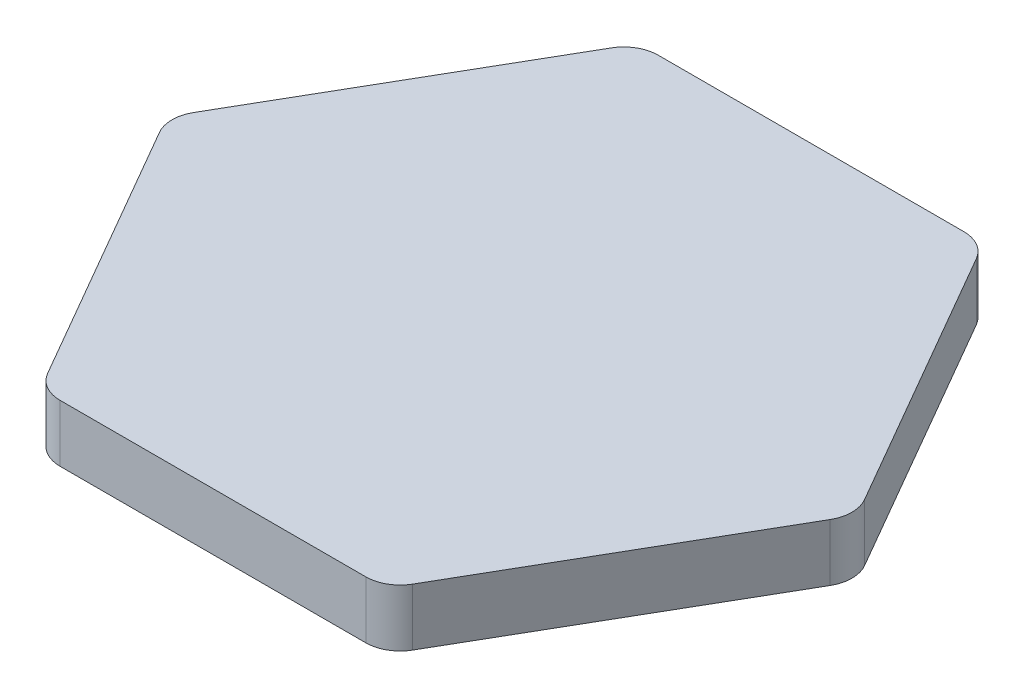
ISO-10303-21;
HEADER;
FILE_DESCRIPTION(('STEP AP214'),'2;1');
FILE_NAME('part.step','',(''),(''),'','','');
FILE_SCHEMA(('AUTOMOTIVE_DESIGN { 1 0 10303 214 1 1 1 1 }'));
ENDSEC;
DATA;
#1=APPLICATION_CONTEXT('core data for automotive mechanical design processes');
#2=APPLICATION_PROTOCOL_DEFINITION('international standard','automotive_design',2000,#1);
#3=PRODUCT_CONTEXT('',#1,'mechanical');
#4=PRODUCT('Part','Part','',(#3));
#5=PRODUCT_RELATED_PRODUCT_CATEGORY('part','',(#4));
#6=PRODUCT_DEFINITION_FORMATION('','',#4);
#7=PRODUCT_DEFINITION_CONTEXT('part definition',#1,'design');
#8=PRODUCT_DEFINITION('design','',#6,#7);
#9=PRODUCT_DEFINITION_SHAPE('','',#8);
#10=(LENGTH_UNIT() NAMED_UNIT(*) SI_UNIT(.MILLI.,.METRE.));
#11=(NAMED_UNIT(*) PLANE_ANGLE_UNIT() SI_UNIT($,.RADIAN.));
#12=(NAMED_UNIT(*) SI_UNIT($,.STERADIAN.) SOLID_ANGLE_UNIT());
#13=UNCERTAINTY_MEASURE_WITH_UNIT(LENGTH_MEASURE(1.E-05),#10,'distance_accuracy_value','');
#14=(GEOMETRIC_REPRESENTATION_CONTEXT(3) GLOBAL_UNCERTAINTY_ASSIGNED_CONTEXT((#13)) GLOBAL_UNIT_ASSIGNED_CONTEXT((#10,
#11,#12)) REPRESENTATION_CONTEXT('',''));
#15=CARTESIAN_POINT('',(0.,0.,0.));
#16=DIRECTION('',(0.,0.,1.));
#17=DIRECTION('',(1.,0.,0.));
#18=AXIS2_PLACEMENT_3D('',#15,#16,#17);
#19=CARTESIAN_POINT('',(-15.100109268027,5.,-26.1541564520638));
#20=DIRECTION('',(0.866025403784442,0.,0.499999999999995));
#21=DIRECTION('',(0.499999999999995,0.,-0.866025403784442));
#22=AXIS2_PLACEMENT_3D('',#19,#20,#21);
#23=PLANE('',#22);
#24=DIRECTION('',(-0.499999999999995,0.,0.866025403784441));
#25=VECTOR('',#24,1.);
#26=CARTESIAN_POINT('',(-15.100109268027,0.,-26.1541564520638));
#27=LINE('',#26,#25);
#28=CARTESIAN_POINT('',(-15.9661346718115,0.,-24.6541564520638));
#29=VERTEX_POINT('',#28);
#30=CARTESIAN_POINT('',(-29.334193132269,0.,-1.5));
#31=VERTEX_POINT('',#30);
#32=EDGE_CURVE('E162',#29,#31,#27,.T.);
#33=ORIENTED_EDGE('',*,*,#32,.T.);
#34=DIRECTION('',(0.,-1.,0.));
#35=VECTOR('',#34,1.);
#36=CARTESIAN_POINT('',(-29.3341931322691,5.,-1.49999999999999));
#37=LINE('',#36,#35);
#38=CARTESIAN_POINT('',(-29.334193132269,5.,-1.5));
#39=VERTEX_POINT('',#38);
#40=EDGE_CURVE('E137',#31,#39,#37,.F.);
#41=ORIENTED_EDGE('',*,*,#40,.T.);
#42=DIRECTION('',(-0.499999999999995,0.,0.866025403784441));
#43=VECTOR('',#42,1.);
#44=CARTESIAN_POINT('',(-15.100109268027,5.,-26.1541564520638));
#45=LINE('',#44,#43);
#46=CARTESIAN_POINT('',(-15.9661346718115,5.,-24.6541564520638));
#47=VERTEX_POINT('',#46);
#48=EDGE_CURVE('E182',#47,#39,#45,.T.);
#49=ORIENTED_EDGE('',*,*,#48,.F.);
#50=DIRECTION('',(0.,-1.,0.));
#51=VECTOR('',#50,1.);
#52=CARTESIAN_POINT('',(-15.9661346718115,5.,-24.6541564520638));
#53=LINE('',#52,#51);
#54=EDGE_CURVE('E143',#47,#29,#53,.T.);
#55=ORIENTED_EDGE('',*,*,#54,.T.);
#56=EDGE_LOOP('',(#33,#41,#49,#55));
#57=FACE_BOUND('',#56,.T.);
#58=ADVANCED_FACE('F41',(#57),#23,.F.);
#59=CARTESIAN_POINT('',(-30.2002185360535,5.,0.));
#60=DIRECTION('',(0.866025403784438,0.,-0.500000000000001));
#61=DIRECTION('',(-0.500000000000001,0.,-0.866025403784438));
#62=AXIS2_PLACEMENT_3D('',#59,#60,#61);
#63=PLANE('',#62);
#64=DIRECTION('',(0.500000000000001,0.,0.866025403784438));
#65=VECTOR('',#64,1.);
#66=CARTESIAN_POINT('',(-30.2002185360535,5.,0.));
#67=LINE('',#66,#65);
#68=CARTESIAN_POINT('',(-29.334193132269,5.,1.49999999999999));
#69=VERTEX_POINT('',#68);
#70=CARTESIAN_POINT('',(-15.9661346718111,5.,24.654156452064));
#71=VERTEX_POINT('',#70);
#72=EDGE_CURVE('E153',#69,#71,#67,.T.);
#73=ORIENTED_EDGE('',*,*,#72,.F.);
#74=DIRECTION('',(0.,-1.,0.));
#75=VECTOR('',#74,1.);
#76=CARTESIAN_POINT('',(-29.334193132269,5.,1.49999999999999));
#77=LINE('',#76,#75);
#78=CARTESIAN_POINT('',(-29.334193132269,0.,1.49999999999999));
#79=VERTEX_POINT('',#78);
#80=EDGE_CURVE('E136',#69,#79,#77,.T.);
#81=ORIENTED_EDGE('',*,*,#80,.T.);
#82=DIRECTION('',(0.500000000000001,0.,0.866025403784438));
#83=VECTOR('',#82,1.);
#84=CARTESIAN_POINT('',(-30.2002185360535,0.,0.));
#85=LINE('',#84,#83);
#86=CARTESIAN_POINT('',(-15.9661346718111,0.,24.654156452064));
#87=VERTEX_POINT('',#86);
#88=EDGE_CURVE('E150',#79,#87,#85,.T.);
#89=ORIENTED_EDGE('',*,*,#88,.T.);
#90=DIRECTION('',(0.,-1.,0.));
#91=VECTOR('',#90,1.);
#92=CARTESIAN_POINT('',(-15.9661346718111,5.,24.654156452064));
#93=LINE('',#92,#91);
#94=EDGE_CURVE('E156',#87,#71,#93,.F.);
#95=ORIENTED_EDGE('',*,*,#94,.T.);
#96=EDGE_LOOP('',(#73,#81,#89,#95));
#97=FACE_BOUND('',#96,.T.);
#98=ADVANCED_FACE('F149',(#97),#63,.F.);
#99=CARTESIAN_POINT('',(-15.1001092680267,5.,26.154156452064));
#100=DIRECTION('',(0.,0.,-1.));
#101=DIRECTION('',(-1.,0.,0.));
#102=AXIS2_PLACEMENT_3D('',#99,#100,#101);
#103=PLANE('',#102);
#104=DIRECTION('',(1.,0.,0.));
#105=VECTOR('',#104,1.);
#106=CARTESIAN_POINT('',(-15.1001092680267,0.,26.154156452064));
#107=LINE('',#106,#105);
#108=CARTESIAN_POINT('',(-13.3680584604578,0.,26.154156452064));
#109=VERTEX_POINT('',#108);
#110=CARTESIAN_POINT('',(13.368058460458,0.,26.1541564520639));
#111=VERTEX_POINT('',#110);
#112=EDGE_CURVE('E161',#109,#111,#107,.T.);
#113=ORIENTED_EDGE('',*,*,#112,.T.);
#114=DIRECTION('',(0.,-1.,0.));
#115=VECTOR('',#114,1.);
#116=CARTESIAN_POINT('',(13.368058460458,5.,26.1541564520639));
#117=LINE('',#116,#115);
#118=CARTESIAN_POINT('',(13.368058460458,5.,26.1541564520639));
#119=VERTEX_POINT('',#118);
#120=EDGE_CURVE('E11',#111,#119,#117,.F.);
#121=ORIENTED_EDGE('',*,*,#120,.T.);
#122=DIRECTION('',(1.,0.,0.));
#123=VECTOR('',#122,1.);
#124=CARTESIAN_POINT('',(-15.1001092680267,5.,26.154156452064));
#125=LINE('',#124,#123);
#126=CARTESIAN_POINT('',(-13.3680584604578,5.,26.154156452064));
#127=VERTEX_POINT('',#126);
#128=EDGE_CURVE('E248',#127,#119,#125,.T.);
#129=ORIENTED_EDGE('',*,*,#128,.F.);
#130=DIRECTION('',(0.,-1.,0.));
#131=VECTOR('',#130,1.);
#132=CARTESIAN_POINT('',(-13.3680584604578,5.,26.154156452064));
#133=LINE('',#132,#131);
#134=EDGE_CURVE('E50',#127,#109,#133,.T.);
#135=ORIENTED_EDGE('',*,*,#134,.T.);
#136=EDGE_LOOP('',(#113,#121,#129,#135));
#137=FACE_BOUND('',#136,.T.);
#138=ADVANCED_FACE('F245',(#137),#103,.F.);
#139=CARTESIAN_POINT('',(15.1001092680269,5.,26.1541564520639));
#140=DIRECTION('',(-0.866025403784442,0.,-0.499999999999995));
#141=DIRECTION('',(-0.499999999999995,0.,0.866025403784442));
#142=AXIS2_PLACEMENT_3D('',#139,#140,#141);
#143=PLANE('',#142);
#144=DIRECTION('',(0.499999999999995,0.,-0.866025403784442));
#145=VECTOR('',#144,1.);
#146=CARTESIAN_POINT('',(15.1001092680269,0.,26.1541564520639));
#147=LINE('',#146,#145);
#148=CARTESIAN_POINT('',(15.9661346718113,0.,24.6541564520639));
#149=VERTEX_POINT('',#148);
#150=CARTESIAN_POINT('',(29.334193132269,0.,1.49999999999979));
#151=VERTEX_POINT('',#150);
#152=EDGE_CURVE('E167',#149,#151,#147,.T.);
#153=ORIENTED_EDGE('',*,*,#152,.T.);
#154=DIRECTION('',(0.,-1.,0.));
#155=VECTOR('',#154,1.);
#156=CARTESIAN_POINT('',(29.334193132269,5.,1.4999999999998));
#157=LINE('',#156,#155);
#158=CARTESIAN_POINT('',(29.334193132269,5.,1.49999999999979));
#159=VERTEX_POINT('',#158);
#160=EDGE_CURVE('E238',#151,#159,#157,.F.);
#161=ORIENTED_EDGE('',*,*,#160,.T.);
#162=DIRECTION('',(0.499999999999995,0.,-0.866025403784442));
#163=VECTOR('',#162,1.);
#164=CARTESIAN_POINT('',(15.1001092680269,5.,26.1541564520639));
#165=LINE('',#164,#163);
#166=CARTESIAN_POINT('',(15.9661346718113,5.,24.6541564520639));
#167=VERTEX_POINT('',#166);
#168=EDGE_CURVE('E261',#167,#159,#165,.T.);
#169=ORIENTED_EDGE('',*,*,#168,.F.);
#170=DIRECTION('',(0.,-1.,0.));
#171=VECTOR('',#170,1.);
#172=CARTESIAN_POINT('',(15.9661346718113,5.,24.6541564520639));
#173=LINE('',#172,#171);
#174=EDGE_CURVE('E234',#167,#149,#173,.T.);
#175=ORIENTED_EDGE('',*,*,#174,.T.);
#176=EDGE_LOOP('',(#153,#161,#169,#175));
#177=FACE_BOUND('',#176,.T.);
#178=ADVANCED_FACE('F258',(#177),#143,.F.);
#179=CARTESIAN_POINT('',(30.2002185360535,5.,-2.1088699889523E-13));
#180=DIRECTION('',(-0.866025403784435,0.,0.500000000000007));
#181=DIRECTION('',(0.500000000000007,0.,0.866025403784435));
#182=AXIS2_PLACEMENT_3D('',#179,#180,#181);
#183=PLANE('',#182);
#184=DIRECTION('',(-0.500000000000007,0.,-0.866025403784435));
#185=VECTOR('',#184,1.);
#186=CARTESIAN_POINT('',(30.2002185360535,0.,-2.1088699889523E-13));
#187=LINE('',#186,#185);
#188=CARTESIAN_POINT('',(29.334193132269,0.,-1.50000000000021));
#189=VERTEX_POINT('',#188);
#190=CARTESIAN_POINT('',(15.966134671811,0.,-24.6541564520641));
#191=VERTEX_POINT('',#190);
#192=EDGE_CURVE('E175',#189,#191,#187,.T.);
#193=ORIENTED_EDGE('',*,*,#192,.T.);
#194=DIRECTION('',(0.,-1.,0.));
#195=VECTOR('',#194,1.);
#196=CARTESIAN_POINT('',(15.966134671811,5.,-24.6541564520642));
#197=LINE('',#196,#195);
#198=CARTESIAN_POINT('',(15.966134671811,5.,-24.6541564520641));
#199=VERTEX_POINT('',#198);
#200=EDGE_CURVE('E231',#191,#199,#197,.F.);
#201=ORIENTED_EDGE('',*,*,#200,.T.);
#202=DIRECTION('',(-0.500000000000007,0.,-0.866025403784435));
#203=VECTOR('',#202,1.);
#204=CARTESIAN_POINT('',(30.2002185360535,5.,-2.1088699889523E-13));
#205=LINE('',#204,#203);
#206=CARTESIAN_POINT('',(29.334193132269,5.,-1.50000000000021));
#207=VERTEX_POINT('',#206);
#208=EDGE_CURVE('E264',#207,#199,#205,.T.);
#209=ORIENTED_EDGE('',*,*,#208,.F.);
#210=DIRECTION('',(0.,-1.,0.));
#211=VECTOR('',#210,1.);
#212=CARTESIAN_POINT('',(29.334193132269,5.,-1.50000000000021));
#213=LINE('',#212,#211);
#214=EDGE_CURVE('E227',#207,#189,#213,.T.);
#215=ORIENTED_EDGE('',*,*,#214,.T.);
#216=EDGE_LOOP('',(#193,#201,#209,#215));
#217=FACE_BOUND('',#216,.T.);
#218=ADVANCED_FACE('F288',(#217),#183,.F.);
#219=CARTESIAN_POINT('',(15.1001092680265,5.,-26.1541564520641));
#220=DIRECTION('',(0.,0.,1.));
#221=DIRECTION('',(1.,0.,0.));
#222=AXIS2_PLACEMENT_3D('',#219,#220,#221);
#223=PLANE('',#222);
#224=DIRECTION('',(-1.,0.,0.));
#225=VECTOR('',#224,1.);
#226=CARTESIAN_POINT('',(15.1001092680265,0.,-26.1541564520641));
#227=LINE('',#226,#225);
#228=CARTESIAN_POINT('',(13.3680584604576,0.,-26.1541564520641));
#229=VERTEX_POINT('',#228);
#230=CARTESIAN_POINT('',(-13.3680584604582,0.,-26.1541564520638));
#231=VERTEX_POINT('',#230);
#232=EDGE_CURVE('E179',#229,#231,#227,.T.);
#233=ORIENTED_EDGE('',*,*,#232,.T.);
#234=DIRECTION('',(0.,-1.,0.));
#235=VECTOR('',#234,1.);
#236=CARTESIAN_POINT('',(-13.3680584604582,5.,-26.1541564520638));
#237=LINE('',#236,#235);
#238=CARTESIAN_POINT('',(-13.3680584604582,5.,-26.1541564520638));
#239=VERTEX_POINT('',#238);
#240=EDGE_CURVE('E57',#231,#239,#237,.F.);
#241=ORIENTED_EDGE('',*,*,#240,.T.);
#242=DIRECTION('',(-1.,0.,0.));
#243=VECTOR('',#242,1.);
#244=CARTESIAN_POINT('',(15.1001092680265,5.,-26.1541564520641));
#245=LINE('',#244,#243);
#246=CARTESIAN_POINT('',(13.3680584604576,5.,-26.1541564520641));
#247=VERTEX_POINT('',#246);
#248=EDGE_CURVE('E184',#247,#239,#245,.T.);
#249=ORIENTED_EDGE('',*,*,#248,.F.);
#250=DIRECTION('',(0.,-1.,0.));
#251=VECTOR('',#250,1.);
#252=CARTESIAN_POINT('',(13.3680584604576,5.,-26.1541564520641));
#253=LINE('',#252,#251);
#254=EDGE_CURVE('E221',#247,#229,#253,.T.);
#255=ORIENTED_EDGE('',*,*,#254,.T.);
#256=EDGE_LOOP('',(#233,#241,#249,#255));
#257=FACE_BOUND('',#256,.T.);
#258=ADVANCED_FACE('F282',(#257),#223,.F.);
#259=CARTESIAN_POINT('',(0.,5.,0.));
#260=DIRECTION('',(0.,1.,0.));
#261=DIRECTION('',(0.,0.,1.));
#262=AXIS2_PLACEMENT_3D('',#259,#260,#261);
#263=PLANE('',#262);
#264=ORIENTED_EDGE('',*,*,#48,.T.);
#265=CARTESIAN_POINT('',(-26.7361169209157,5.,0.));
#266=DIRECTION('',(0.,1.,0.));
#267=DIRECTION('',(0.,0.,1.));
#268=AXIS2_PLACEMENT_3D('',#265,#266,#267);
#269=CIRCLE('',#268,3.);
#270=EDGE_CURVE('E218',#39,#69,#269,.T.);
#271=ORIENTED_EDGE('',*,*,#270,.T.);
#272=ORIENTED_EDGE('',*,*,#72,.T.);
#273=CARTESIAN_POINT('',(-13.3680584604578,5.,23.154156452064));
#274=DIRECTION('',(0.,1.,0.));
#275=DIRECTION('',(0.,0.,1.));
#276=AXIS2_PLACEMENT_3D('',#273,#274,#275);
#277=CIRCLE('',#276,3.);
#278=EDGE_CURVE('E204',#71,#127,#277,.T.);
#279=ORIENTED_EDGE('',*,*,#278,.T.);
#280=ORIENTED_EDGE('',*,*,#128,.T.);
#281=CARTESIAN_POINT('',(13.368058460458,5.,23.1541564520639));
#282=DIRECTION('',(0.,1.,0.));
#283=DIRECTION('',(0.,0.,1.));
#284=AXIS2_PLACEMENT_3D('',#281,#282,#283);
#285=CIRCLE('',#284,3.);
#286=EDGE_CURVE('E207',#119,#167,#285,.T.);
#287=ORIENTED_EDGE('',*,*,#286,.T.);
#288=ORIENTED_EDGE('',*,*,#168,.T.);
#289=CARTESIAN_POINT('',(26.7361169209157,5.,-1.91686944095437E-13));
#290=DIRECTION('',(0.,1.,0.));
#291=DIRECTION('',(0.,0.,1.));
#292=AXIS2_PLACEMENT_3D('',#289,#290,#291);
#293=CIRCLE('',#292,3.);
#294=EDGE_CURVE('E210',#159,#207,#293,.T.);
#295=ORIENTED_EDGE('',*,*,#294,.T.);
#296=ORIENTED_EDGE('',*,*,#208,.T.);
#297=CARTESIAN_POINT('',(13.3680584604576,5.,-23.1541564520641));
#298=DIRECTION('',(0.,1.,0.));
#299=DIRECTION('',(0.,0.,1.));
#300=AXIS2_PLACEMENT_3D('',#297,#298,#299);
#301=CIRCLE('',#300,3.);
#302=EDGE_CURVE('E64',#199,#247,#301,.T.);
#303=ORIENTED_EDGE('',*,*,#302,.T.);
#304=ORIENTED_EDGE('',*,*,#248,.T.);
#305=CARTESIAN_POINT('',(-13.3680584604581,5.,-23.1541564520638));
#306=DIRECTION('',(0.,1.,0.));
#307=DIRECTION('',(0.,0.,1.));
#308=AXIS2_PLACEMENT_3D('',#305,#306,#307);
#309=CIRCLE('',#308,3.);
#310=EDGE_CURVE('E215',#239,#47,#309,.T.);
#311=ORIENTED_EDGE('',*,*,#310,.T.);
#312=EDGE_LOOP('',(#264,#271,#272,#279,#280,#287,#288,#295,#296,#303,#304,#311));
#313=FACE_BOUND('',#312,.T.);
#314=ADVANCED_FACE('F274',(#313),#263,.T.);
#315=CARTESIAN_POINT('',(0.,0.,0.));
#316=DIRECTION('',(0.,1.,0.));
#317=DIRECTION('',(0.,0.,1.));
#318=AXIS2_PLACEMENT_3D('',#315,#316,#317);
#319=PLANE('',#318);
#320=ORIENTED_EDGE('',*,*,#88,.F.);
#321=CARTESIAN_POINT('',(-26.7361169209157,0.,0.));
#322=DIRECTION('',(0.,1.,0.));
#323=DIRECTION('',(0.,0.,1.));
#324=AXIS2_PLACEMENT_3D('',#321,#322,#323);
#325=CIRCLE('',#324,3.);
#326=EDGE_CURVE('E132',#79,#31,#325,.F.);
#327=ORIENTED_EDGE('',*,*,#326,.T.);
#328=ORIENTED_EDGE('',*,*,#32,.F.);
#329=CARTESIAN_POINT('',(-13.3680584604581,0.,-23.1541564520638));
#330=DIRECTION('',(0.,1.,0.));
#331=DIRECTION('',(0.,0.,1.));
#332=AXIS2_PLACEMENT_3D('',#329,#330,#331);
#333=CIRCLE('',#332,3.);
#334=EDGE_CURVE('E144',#29,#231,#333,.F.);
#335=ORIENTED_EDGE('',*,*,#334,.T.);
#336=ORIENTED_EDGE('',*,*,#232,.F.);
#337=CARTESIAN_POINT('',(13.3680584604576,0.,-23.1541564520641));
#338=DIRECTION('',(0.,1.,0.));
#339=DIRECTION('',(0.,0.,1.));
#340=AXIS2_PLACEMENT_3D('',#337,#338,#339);
#341=CIRCLE('',#340,3.);
#342=EDGE_CURVE('E194',#229,#191,#341,.F.);
#343=ORIENTED_EDGE('',*,*,#342,.T.);
#344=ORIENTED_EDGE('',*,*,#192,.F.);
#345=CARTESIAN_POINT('',(26.7361169209157,0.,-1.91686944095437E-13));
#346=DIRECTION('',(0.,1.,0.));
#347=DIRECTION('',(0.,0.,1.));
#348=AXIS2_PLACEMENT_3D('',#345,#346,#347);
#349=CIRCLE('',#348,3.);
#350=EDGE_CURVE('E191',#189,#151,#349,.F.);
#351=ORIENTED_EDGE('',*,*,#350,.T.);
#352=ORIENTED_EDGE('',*,*,#152,.F.);
#353=CARTESIAN_POINT('',(13.368058460458,0.,23.1541564520639));
#354=DIRECTION('',(0.,1.,0.));
#355=DIRECTION('',(0.,0.,1.));
#356=AXIS2_PLACEMENT_3D('',#353,#354,#355);
#357=CIRCLE('',#356,3.);
#358=EDGE_CURVE('E188',#149,#111,#357,.F.);
#359=ORIENTED_EDGE('',*,*,#358,.T.);
#360=ORIENTED_EDGE('',*,*,#112,.F.);
#361=CARTESIAN_POINT('',(-13.3680584604578,0.,23.154156452064));
#362=DIRECTION('',(0.,1.,0.));
#363=DIRECTION('',(0.,0.,1.));
#364=AXIS2_PLACEMENT_3D('',#361,#362,#363);
#365=CIRCLE('',#364,3.);
#366=EDGE_CURVE('E155',#109,#87,#365,.F.);
#367=ORIENTED_EDGE('',*,*,#366,.T.);
#368=EDGE_LOOP('',(#320,#327,#328,#335,#336,#343,#344,#351,#352,#359,#360,#367));
#369=FACE_BOUND('',#368,.T.);
#370=ADVANCED_FACE('F158',(#369),#319,.F.);
#371=CARTESIAN_POINT('',(-26.7361169209157,5.,0.));
#372=DIRECTION('',(0.,-1.,0.));
#373=DIRECTION('',(0.,0.,-1.));
#374=AXIS2_PLACEMENT_3D('',#371,#372,#373);
#375=CYLINDRICAL_SURFACE('',#374,3.);
#376=ORIENTED_EDGE('',*,*,#270,.F.);
#377=ORIENTED_EDGE('',*,*,#40,.F.);
#378=ORIENTED_EDGE('',*,*,#326,.F.);
#379=ORIENTED_EDGE('',*,*,#80,.F.);
#380=EDGE_LOOP('',(#376,#377,#378,#379));
#381=FACE_BOUND('',#380,.T.);
#382=ADVANCED_FACE('F135',(#381),#375,.T.);
#383=CARTESIAN_POINT('',(-13.3680584604581,5.,-23.1541564520638));
#384=DIRECTION('',(0.,-1.,0.));
#385=DIRECTION('',(0.,0.,-1.));
#386=AXIS2_PLACEMENT_3D('',#383,#384,#385);
#387=CYLINDRICAL_SURFACE('',#386,3.);
#388=ORIENTED_EDGE('',*,*,#310,.F.);
#389=ORIENTED_EDGE('',*,*,#240,.F.);
#390=ORIENTED_EDGE('',*,*,#334,.F.);
#391=ORIENTED_EDGE('',*,*,#54,.F.);
#392=EDGE_LOOP('',(#388,#389,#390,#391));
#393=FACE_BOUND('',#392,.T.);
#394=ADVANCED_FACE('F279',(#393),#387,.T.);
#395=CARTESIAN_POINT('',(13.3680584604576,5.,-23.1541564520641));
#396=DIRECTION('',(0.,-1.,0.));
#397=DIRECTION('',(0.,0.,-1.));
#398=AXIS2_PLACEMENT_3D('',#395,#396,#397);
#399=CYLINDRICAL_SURFACE('',#398,3.);
#400=ORIENTED_EDGE('',*,*,#302,.F.);
#401=ORIENTED_EDGE('',*,*,#200,.F.);
#402=ORIENTED_EDGE('',*,*,#342,.F.);
#403=ORIENTED_EDGE('',*,*,#254,.F.);
#404=EDGE_LOOP('',(#400,#401,#402,#403));
#405=FACE_BOUND('',#404,.T.);
#406=ADVANCED_FACE('F284',(#405),#399,.T.);
#407=CARTESIAN_POINT('',(26.7361169209157,5.,-1.91686944095437E-13));
#408=DIRECTION('',(0.,-1.,0.));
#409=DIRECTION('',(0.,0.,-1.));
#410=AXIS2_PLACEMENT_3D('',#407,#408,#409);
#411=CYLINDRICAL_SURFACE('',#410,3.);
#412=ORIENTED_EDGE('',*,*,#294,.F.);
#413=ORIENTED_EDGE('',*,*,#160,.F.);
#414=ORIENTED_EDGE('',*,*,#350,.F.);
#415=ORIENTED_EDGE('',*,*,#214,.F.);
#416=EDGE_LOOP('',(#412,#413,#414,#415));
#417=FACE_BOUND('',#416,.T.);
#418=ADVANCED_FACE('F292',(#417),#411,.T.);
#419=CARTESIAN_POINT('',(13.368058460458,5.,23.1541564520639));
#420=DIRECTION('',(0.,-1.,0.));
#421=DIRECTION('',(0.,0.,-1.));
#422=AXIS2_PLACEMENT_3D('',#419,#420,#421);
#423=CYLINDRICAL_SURFACE('',#422,3.);
#424=ORIENTED_EDGE('',*,*,#286,.F.);
#425=ORIENTED_EDGE('',*,*,#120,.F.);
#426=ORIENTED_EDGE('',*,*,#358,.F.);
#427=ORIENTED_EDGE('',*,*,#174,.F.);
#428=EDGE_LOOP('',(#424,#425,#426,#427));
#429=FACE_BOUND('',#428,.T.);
#430=ADVANCED_FACE('F255',(#429),#423,.T.);
#431=CARTESIAN_POINT('',(-13.3680584604578,5.,23.154156452064));
#432=DIRECTION('',(0.,-1.,0.));
#433=DIRECTION('',(0.,0.,-1.));
#434=AXIS2_PLACEMENT_3D('',#431,#432,#433);
#435=CYLINDRICAL_SURFACE('',#434,3.);
#436=ORIENTED_EDGE('',*,*,#278,.F.);
#437=ORIENTED_EDGE('',*,*,#94,.F.);
#438=ORIENTED_EDGE('',*,*,#366,.F.);
#439=ORIENTED_EDGE('',*,*,#134,.F.);
#440=EDGE_LOOP('',(#436,#437,#438,#439));
#441=FACE_BOUND('',#440,.T.);
#442=ADVANCED_FACE('F43',(#441),#435,.T.);
#443=CLOSED_SHELL('',(#58,#98,#138,#178,#218,#258,#314,#370,#382,#394,#406,#418,#430,#442));
#444=MANIFOLD_SOLID_BREP('B2',#443);
#445=ADVANCED_BREP_SHAPE_REPRESENTATION('',(#18,#444),#14);
#446=SHAPE_DEFINITION_REPRESENTATION(#9,#445);
ENDSEC;
END-ISO-10303-21;
